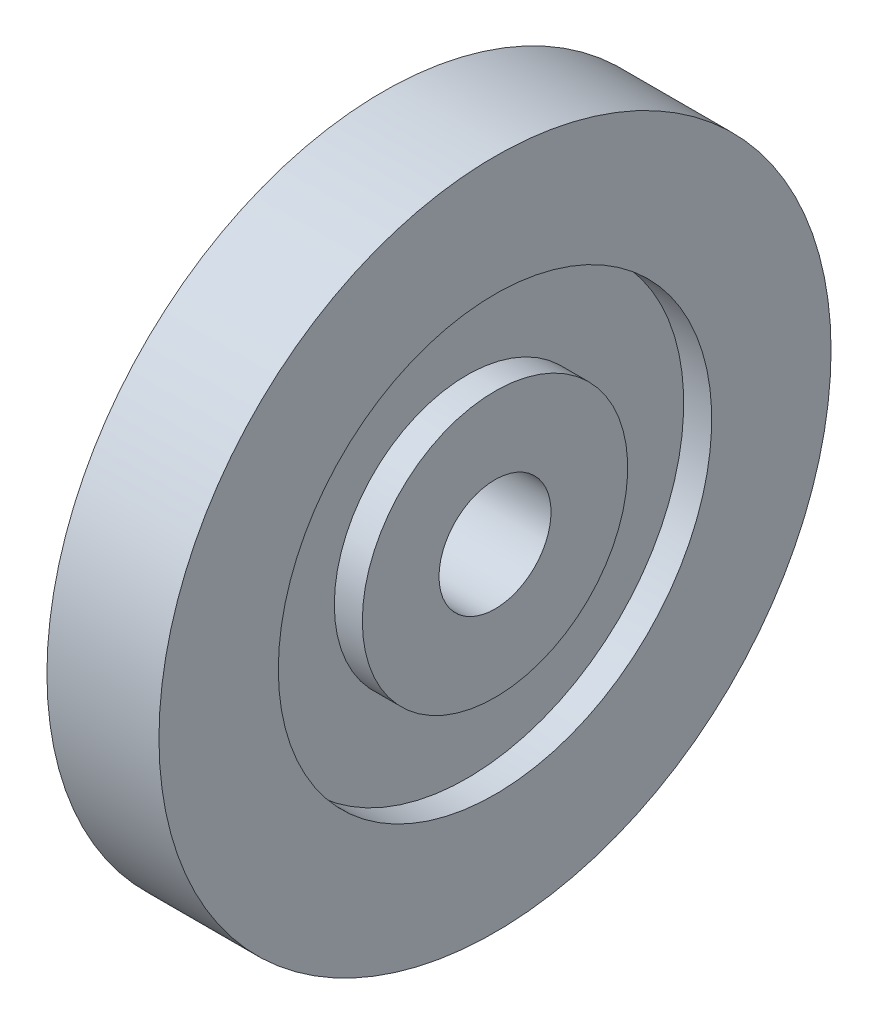
ISO-10303-21;
HEADER;
FILE_DESCRIPTION(('STEP AP214'),'2;1');
FILE_NAME('part.step','',(''),(''),'','','');
FILE_SCHEMA(('AUTOMOTIVE_DESIGN { 1 0 10303 214 1 1 1 1 }'));
ENDSEC;
DATA;
#1=APPLICATION_CONTEXT('core data for automotive mechanical design processes');
#2=APPLICATION_PROTOCOL_DEFINITION('international standard','automotive_design',2000,#1);
#3=PRODUCT_CONTEXT('',#1,'mechanical');
#4=PRODUCT('Part','Part','',(#3));
#5=PRODUCT_RELATED_PRODUCT_CATEGORY('part','',(#4));
#6=PRODUCT_DEFINITION_FORMATION('','',#4);
#7=PRODUCT_DEFINITION_CONTEXT('part definition',#1,'design');
#8=PRODUCT_DEFINITION('design','',#6,#7);
#9=PRODUCT_DEFINITION_SHAPE('','',#8);
#10=(LENGTH_UNIT() NAMED_UNIT(*) SI_UNIT(.MILLI.,.METRE.));
#11=(NAMED_UNIT(*) PLANE_ANGLE_UNIT() SI_UNIT($,.RADIAN.));
#12=(NAMED_UNIT(*) SI_UNIT($,.STERADIAN.) SOLID_ANGLE_UNIT());
#13=UNCERTAINTY_MEASURE_WITH_UNIT(LENGTH_MEASURE(1.E-05),#10,'distance_accuracy_value','');
#14=(GEOMETRIC_REPRESENTATION_CONTEXT(3) GLOBAL_UNCERTAINTY_ASSIGNED_CONTEXT((#13)) GLOBAL_UNIT_ASSIGNED_CONTEXT((#10,
#11,#12)) REPRESENTATION_CONTEXT('',''));
#15=CARTESIAN_POINT('',(0.,0.,0.));
#16=DIRECTION('',(0.,0.,1.));
#17=DIRECTION('',(1.,0.,0.));
#18=AXIS2_PLACEMENT_3D('',#15,#16,#17);
#19=CARTESIAN_POINT('',(-2.,-10.4297542260312,0.));
#20=DIRECTION('',(1.,0.,0.));
#21=DIRECTION('',(0.,0.,-1.));
#22=AXIS2_PLACEMENT_3D('',#19,#20,#21);
#23=PLANE('',#22);
#24=CARTESIAN_POINT('',(-2.,-12.4297542260312,0.));
#25=DIRECTION('',(-1.,0.,0.));
#26=DIRECTION('',(0.,0.,1.));
#27=AXIS2_PLACEMENT_3D('',#24,#25,#26);
#28=CIRCLE('',#27,2.);
#29=CARTESIAN_POINT('',(-2.,-12.4297542260312,2.));
#30=VERTEX_POINT('',#29);
#31=EDGE_CURVE('E71',#30,#30,#28,.T.);
#32=ORIENTED_EDGE('',*,*,#31,.F.);
#33=EDGE_LOOP('',(#32));
#34=FACE_BOUND('',#33,.T.);
#35=CARTESIAN_POINT('',(-2.,-12.4297542260312,0.));
#36=DIRECTION('',(-1.,0.,0.));
#37=DIRECTION('',(0.,0.,1.));
#38=AXIS2_PLACEMENT_3D('',#35,#36,#37);
#39=CIRCLE('',#38,4.73831094461326);
#40=CARTESIAN_POINT('',(-2.,-12.4297542260312,4.73831094461326));
#41=VERTEX_POINT('',#40);
#42=EDGE_CURVE('E10',#41,#41,#39,.T.);
#43=ORIENTED_EDGE('',*,*,#42,.T.);
#44=EDGE_LOOP('',(#43));
#45=FACE_BOUND('',#44,.T.);
#46=ADVANCED_FACE('F31',(#34,#45),#23,.F.);
#47=CARTESIAN_POINT('',(2.,-12.4297542260312,0.));
#48=DIRECTION('',(-1.,0.,0.));
#49=DIRECTION('',(0.,0.,1.));
#50=AXIS2_PLACEMENT_3D('',#47,#48,#49);
#51=CYLINDRICAL_SURFACE('',#50,4.73831094461326);
#52=ORIENTED_EDGE('',*,*,#42,.F.);
#53=EDGE_LOOP('',(#52));
#54=FACE_BOUND('',#53,.T.);
#55=CARTESIAN_POINT('',(-1.,-12.4297542260312,0.));
#56=DIRECTION('',(-1.,0.,0.));
#57=DIRECTION('',(0.,0.,1.));
#58=AXIS2_PLACEMENT_3D('',#55,#56,#57);
#59=CIRCLE('',#58,4.73831094461326);
#60=CARTESIAN_POINT('',(-1.,-12.4297542260312,4.73831094461326));
#61=VERTEX_POINT('',#60);
#62=EDGE_CURVE('E37',#61,#61,#59,.T.);
#63=ORIENTED_EDGE('',*,*,#62,.T.);
#64=EDGE_LOOP('',(#63));
#65=FACE_BOUND('',#64,.T.);
#66=ADVANCED_FACE('F78',(#54,#65),#51,.T.);
#67=CARTESIAN_POINT('',(-1.,-7.6914432814179,0.));
#68=DIRECTION('',(1.,0.,0.));
#69=DIRECTION('',(0.,0.,-1.));
#70=AXIS2_PLACEMENT_3D('',#67,#68,#69);
#71=PLANE('',#70);
#72=ORIENTED_EDGE('',*,*,#62,.F.);
#73=EDGE_LOOP('',(#72));
#74=FACE_BOUND('',#73,.T.);
#75=CARTESIAN_POINT('',(-1.,-12.4297542260312,0.));
#76=DIRECTION('',(-1.,0.,0.));
#77=DIRECTION('',(0.,0.,1.));
#78=AXIS2_PLACEMENT_3D('',#75,#76,#77);
#79=CIRCLE('',#78,7.73831094461326);
#80=CARTESIAN_POINT('',(-1.,-12.4297542260312,7.73831094461326));
#81=VERTEX_POINT('',#80);
#82=EDGE_CURVE('E41',#81,#81,#79,.T.);
#83=ORIENTED_EDGE('',*,*,#82,.T.);
#84=EDGE_LOOP('',(#83));
#85=FACE_BOUND('',#84,.T.);
#86=ADVANCED_FACE('F82',(#74,#85),#71,.F.);
#87=CARTESIAN_POINT('',(2.,-12.4297542260312,0.));
#88=DIRECTION('',(-1.,0.,0.));
#89=DIRECTION('',(0.,0.,1.));
#90=AXIS2_PLACEMENT_3D('',#87,#88,#89);
#91=CYLINDRICAL_SURFACE('',#90,7.73831094461326);
#92=ORIENTED_EDGE('',*,*,#82,.F.);
#93=EDGE_LOOP('',(#92));
#94=FACE_BOUND('',#93,.T.);
#95=CARTESIAN_POINT('',(-2.,-12.4297542260312,0.));
#96=DIRECTION('',(-1.,0.,0.));
#97=DIRECTION('',(0.,0.,1.));
#98=AXIS2_PLACEMENT_3D('',#95,#96,#97);
#99=CIRCLE('',#98,7.73831094461326);
#100=CARTESIAN_POINT('',(-2.,-12.4297542260312,7.73831094461326));
#101=VERTEX_POINT('',#100);
#102=EDGE_CURVE('E45',#101,#101,#99,.T.);
#103=ORIENTED_EDGE('',*,*,#102,.T.);
#104=EDGE_LOOP('',(#103));
#105=FACE_BOUND('',#104,.T.);
#106=ADVANCED_FACE('F87',(#94,#105),#91,.F.);
#107=CARTESIAN_POINT('',(-2.,-0.42975422603116,0.));
#108=DIRECTION('',(1.,0.,0.));
#109=DIRECTION('',(0.,0.,-1.));
#110=AXIS2_PLACEMENT_3D('',#107,#108,#109);
#111=PLANE('',#110);
#112=ORIENTED_EDGE('',*,*,#102,.F.);
#113=EDGE_LOOP('',(#112));
#114=FACE_BOUND('',#113,.T.);
#115=CARTESIAN_POINT('',(-2.,-12.4297542260312,0.));
#116=DIRECTION('',(-1.,0.,0.));
#117=DIRECTION('',(0.,0.,1.));
#118=AXIS2_PLACEMENT_3D('',#115,#116,#117);
#119=CIRCLE('',#118,12.);
#120=CARTESIAN_POINT('',(-2.,-12.4297542260312,12.));
#121=VERTEX_POINT('',#120);
#122=EDGE_CURVE('E50',#121,#121,#119,.T.);
#123=ORIENTED_EDGE('',*,*,#122,.T.);
#124=EDGE_LOOP('',(#123));
#125=FACE_BOUND('',#124,.T.);
#126=ADVANCED_FACE('F93',(#114,#125),#111,.F.);
#127=CARTESIAN_POINT('',(2.,-12.4297542260312,0.));
#128=DIRECTION('',(-1.,0.,0.));
#129=DIRECTION('',(0.,0.,1.));
#130=AXIS2_PLACEMENT_3D('',#127,#128,#129);
#131=CYLINDRICAL_SURFACE('',#130,12.);
#132=ORIENTED_EDGE('',*,*,#122,.F.);
#133=EDGE_LOOP('',(#132));
#134=FACE_BOUND('',#133,.T.);
#135=CARTESIAN_POINT('',(2.,-12.4297542260312,0.));
#136=DIRECTION('',(-1.,0.,0.));
#137=DIRECTION('',(0.,0.,1.));
#138=AXIS2_PLACEMENT_3D('',#135,#136,#137);
#139=CIRCLE('',#138,12.);
#140=CARTESIAN_POINT('',(2.,-12.4297542260312,12.));
#141=VERTEX_POINT('',#140);
#142=EDGE_CURVE('E53',#141,#141,#139,.T.);
#143=ORIENTED_EDGE('',*,*,#142,.T.);
#144=EDGE_LOOP('',(#143));
#145=FACE_BOUND('',#144,.T.);
#146=ADVANCED_FACE('F97',(#134,#145),#131,.T.);
#147=CARTESIAN_POINT('',(2.,-0.42975422603116,0.));
#148=DIRECTION('',(-1.,0.,0.));
#149=DIRECTION('',(0.,0.,1.));
#150=AXIS2_PLACEMENT_3D('',#147,#148,#149);
#151=PLANE('',#150);
#152=ORIENTED_EDGE('',*,*,#142,.F.);
#153=EDGE_LOOP('',(#152));
#154=FACE_BOUND('',#153,.T.);
#155=CARTESIAN_POINT('',(2.,-12.4297542260312,0.));
#156=DIRECTION('',(-1.,0.,0.));
#157=DIRECTION('',(0.,0.,1.));
#158=AXIS2_PLACEMENT_3D('',#155,#156,#157);
#159=CIRCLE('',#158,7.73831094461326);
#160=CARTESIAN_POINT('',(2.,-12.4297542260312,7.73831094461326));
#161=VERTEX_POINT('',#160);
#162=EDGE_CURVE('E56',#161,#161,#159,.T.);
#163=ORIENTED_EDGE('',*,*,#162,.T.);
#164=EDGE_LOOP('',(#163));
#165=FACE_BOUND('',#164,.T.);
#166=ADVANCED_FACE('F101',(#154,#165),#151,.F.);
#167=CARTESIAN_POINT('',(2.,-12.4297542260312,0.));
#168=DIRECTION('',(-1.,0.,0.));
#169=DIRECTION('',(0.,0.,1.));
#170=AXIS2_PLACEMENT_3D('',#167,#168,#169);
#171=CYLINDRICAL_SURFACE('',#170,7.73831094461326);
#172=ORIENTED_EDGE('',*,*,#162,.F.);
#173=EDGE_LOOP('',(#172));
#174=FACE_BOUND('',#173,.T.);
#175=CARTESIAN_POINT('',(1.,-12.4297542260312,0.));
#176=DIRECTION('',(-1.,0.,0.));
#177=DIRECTION('',(0.,0.,1.));
#178=AXIS2_PLACEMENT_3D('',#175,#176,#177);
#179=CIRCLE('',#178,7.73831094461326);
#180=CARTESIAN_POINT('',(1.,-12.4297542260312,7.73831094461326));
#181=VERTEX_POINT('',#180);
#182=EDGE_CURVE('E59',#181,#181,#179,.T.);
#183=ORIENTED_EDGE('',*,*,#182,.T.);
#184=EDGE_LOOP('',(#183));
#185=FACE_BOUND('',#184,.T.);
#186=ADVANCED_FACE('F105',(#174,#185),#171,.F.);
#187=CARTESIAN_POINT('',(1.,-7.6914432814179,0.));
#188=DIRECTION('',(-1.,0.,0.));
#189=DIRECTION('',(0.,0.,1.));
#190=AXIS2_PLACEMENT_3D('',#187,#188,#189);
#191=PLANE('',#190);
#192=ORIENTED_EDGE('',*,*,#182,.F.);
#193=EDGE_LOOP('',(#192));
#194=FACE_BOUND('',#193,.T.);
#195=CARTESIAN_POINT('',(1.,-12.4297542260312,0.));
#196=DIRECTION('',(-1.,0.,0.));
#197=DIRECTION('',(0.,0.,1.));
#198=AXIS2_PLACEMENT_3D('',#195,#196,#197);
#199=CIRCLE('',#198,4.73831094461326);
#200=CARTESIAN_POINT('',(1.,-12.4297542260312,4.73831094461326));
#201=VERTEX_POINT('',#200);
#202=EDGE_CURVE('E62',#201,#201,#199,.T.);
#203=ORIENTED_EDGE('',*,*,#202,.T.);
#204=EDGE_LOOP('',(#203));
#205=FACE_BOUND('',#204,.T.);
#206=ADVANCED_FACE('F109',(#194,#205),#191,.F.);
#207=CARTESIAN_POINT('',(2.,-12.4297542260312,0.));
#208=DIRECTION('',(-1.,0.,0.));
#209=DIRECTION('',(0.,0.,1.));
#210=AXIS2_PLACEMENT_3D('',#207,#208,#209);
#211=CYLINDRICAL_SURFACE('',#210,4.73831094461326);
#212=ORIENTED_EDGE('',*,*,#202,.F.);
#213=EDGE_LOOP('',(#212));
#214=FACE_BOUND('',#213,.T.);
#215=CARTESIAN_POINT('',(2.,-12.4297542260312,0.));
#216=DIRECTION('',(-1.,0.,0.));
#217=DIRECTION('',(0.,0.,1.));
#218=AXIS2_PLACEMENT_3D('',#215,#216,#217);
#219=CIRCLE('',#218,4.73831094461326);
#220=CARTESIAN_POINT('',(2.,-12.4297542260312,4.73831094461326));
#221=VERTEX_POINT('',#220);
#222=EDGE_CURVE('E65',#221,#221,#219,.T.);
#223=ORIENTED_EDGE('',*,*,#222,.T.);
#224=EDGE_LOOP('',(#223));
#225=FACE_BOUND('',#224,.T.);
#226=ADVANCED_FACE('F113',(#214,#225),#211,.T.);
#227=CARTESIAN_POINT('',(2.,-10.4297542260312,0.));
#228=DIRECTION('',(-1.,0.,0.));
#229=DIRECTION('',(0.,0.,1.));
#230=AXIS2_PLACEMENT_3D('',#227,#228,#229);
#231=PLANE('',#230);
#232=ORIENTED_EDGE('',*,*,#222,.F.);
#233=EDGE_LOOP('',(#232));
#234=FACE_BOUND('',#233,.T.);
#235=CARTESIAN_POINT('',(2.,-12.4297542260312,0.));
#236=DIRECTION('',(-1.,0.,0.));
#237=DIRECTION('',(0.,0.,1.));
#238=AXIS2_PLACEMENT_3D('',#235,#236,#237);
#239=CIRCLE('',#238,2.);
#240=CARTESIAN_POINT('',(2.,-12.4297542260312,2.));
#241=VERTEX_POINT('',#240);
#242=EDGE_CURVE('E68',#241,#241,#239,.T.);
#243=ORIENTED_EDGE('',*,*,#242,.T.);
#244=EDGE_LOOP('',(#243));
#245=FACE_BOUND('',#244,.T.);
#246=ADVANCED_FACE('F117',(#234,#245),#231,.F.);
#247=CARTESIAN_POINT('',(2.,-12.4297542260312,0.));
#248=DIRECTION('',(-1.,0.,0.));
#249=DIRECTION('',(0.,0.,1.));
#250=AXIS2_PLACEMENT_3D('',#247,#248,#249);
#251=CYLINDRICAL_SURFACE('',#250,2.);
#252=ORIENTED_EDGE('',*,*,#242,.F.);
#253=EDGE_LOOP('',(#252));
#254=FACE_BOUND('',#253,.T.);
#255=ORIENTED_EDGE('',*,*,#31,.T.);
#256=EDGE_LOOP('',(#255));
#257=FACE_BOUND('',#256,.T.);
#258=ADVANCED_FACE('F75',(#254,#257),#251,.F.);
#259=CLOSED_SHELL('',(#46,#66,#86,#106,#126,#146,#166,#186,#206,#226,#246,#258));
#260=MANIFOLD_SOLID_BREP('B2',#259);
#261=ADVANCED_BREP_SHAPE_REPRESENTATION('',(#18,#260),#14);
#262=SHAPE_DEFINITION_REPRESENTATION(#9,#261);
ENDSEC;
END-ISO-10303-21;
